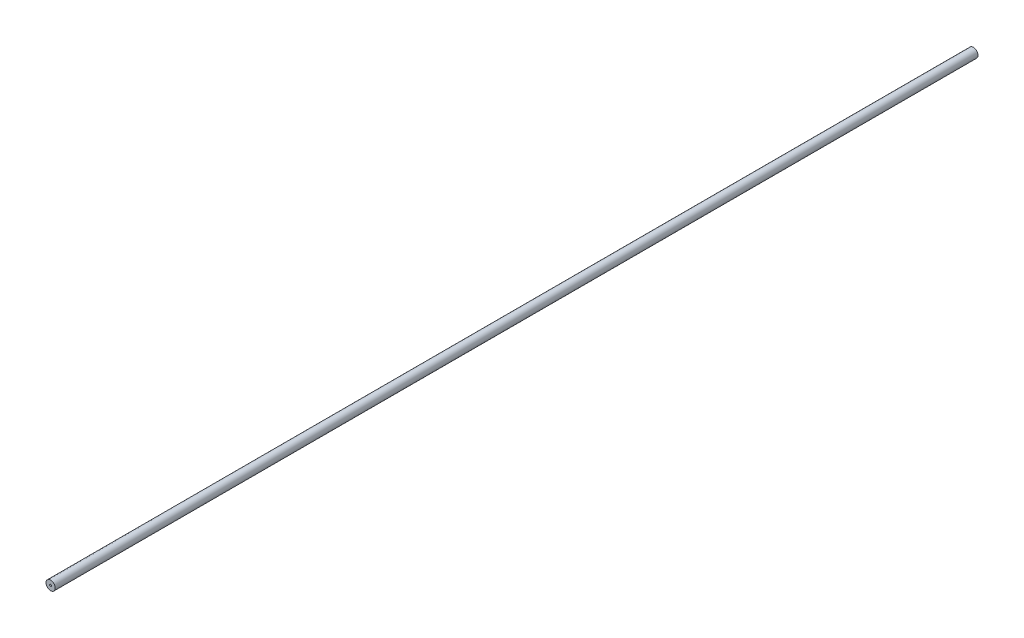
ISO-10303-21;
HEADER;
FILE_DESCRIPTION(('STEP AP214'),'2;1');
FILE_NAME('part.step','',(''),(''),'','','');
FILE_SCHEMA(('AUTOMOTIVE_DESIGN { 1 0 10303 214 1 1 1 1 }'));
ENDSEC;
DATA;
#1=APPLICATION_CONTEXT('core data for automotive mechanical design processes');
#2=APPLICATION_PROTOCOL_DEFINITION('international standard','automotive_design',2000,#1);
#3=PRODUCT_CONTEXT('',#1,'mechanical');
#4=PRODUCT('Part','Part','',(#3));
#5=PRODUCT_RELATED_PRODUCT_CATEGORY('part','',(#4));
#6=PRODUCT_DEFINITION_FORMATION('','',#4);
#7=PRODUCT_DEFINITION_CONTEXT('part definition',#1,'design');
#8=PRODUCT_DEFINITION('design','',#6,#7);
#9=PRODUCT_DEFINITION_SHAPE('','',#8);
#10=(LENGTH_UNIT() NAMED_UNIT(*) SI_UNIT(.MILLI.,.METRE.));
#11=(NAMED_UNIT(*) PLANE_ANGLE_UNIT() SI_UNIT($,.RADIAN.));
#12=(NAMED_UNIT(*) SI_UNIT($,.STERADIAN.) SOLID_ANGLE_UNIT());
#13=UNCERTAINTY_MEASURE_WITH_UNIT(LENGTH_MEASURE(1.E-05),#10,'distance_accuracy_value','');
#14=(GEOMETRIC_REPRESENTATION_CONTEXT(3) GLOBAL_UNCERTAINTY_ASSIGNED_CONTEXT((#13)) GLOBAL_UNIT_ASSIGNED_CONTEXT((#10,
#11,#12)) REPRESENTATION_CONTEXT('',''));
#15=CARTESIAN_POINT('',(0.,0.,0.));
#16=DIRECTION('',(0.,0.,1.));
#17=DIRECTION('',(1.,0.,0.));
#18=AXIS2_PLACEMENT_3D('',#15,#16,#17);
#19=CARTESIAN_POINT('',(0.,0.,500.));
#20=DIRECTION('',(0.,0.,1.));
#21=DIRECTION('',(1.,0.,0.));
#22=AXIS2_PLACEMENT_3D('',#19,#20,#21);
#23=PLANE('',#22);
#24=CARTESIAN_POINT('',(0.,0.,500.));
#25=DIRECTION('',(0.,0.,1.));
#26=DIRECTION('',(1.,0.,0.));
#27=AXIS2_PLACEMENT_3D('',#24,#25,#26);
#28=CIRCLE('',#27,2.5);
#29=CARTESIAN_POINT('',(2.5,0.,500.));
#30=VERTEX_POINT('',#29);
#31=EDGE_CURVE('E11',#30,#30,#28,.T.);
#32=ORIENTED_EDGE('',*,*,#31,.T.);
#33=EDGE_LOOP('',(#32));
#34=FACE_BOUND('',#33,.T.);
#35=CARTESIAN_POINT('',(0.,0.,500.));
#36=DIRECTION('',(0.,0.,1.));
#37=DIRECTION('',(1.,0.,0.));
#38=AXIS2_PLACEMENT_3D('',#35,#36,#37);
#39=CIRCLE('',#38,0.5);
#40=CARTESIAN_POINT('',(0.5,0.,500.));
#41=VERTEX_POINT('',#40);
#42=EDGE_CURVE('E60',#41,#41,#39,.T.);
#43=ORIENTED_EDGE('',*,*,#42,.F.);
#44=EDGE_LOOP('',(#43));
#45=FACE_BOUND('',#44,.T.);
#46=ADVANCED_FACE('F47',(#34,#45),#23,.T.);
#47=CARTESIAN_POINT('',(0.,0.,0.));
#48=DIRECTION('',(0.,0.,1.));
#49=DIRECTION('',(1.,0.,0.));
#50=AXIS2_PLACEMENT_3D('',#47,#48,#49);
#51=PLANE('',#50);
#52=CARTESIAN_POINT('',(0.,0.,0.));
#53=DIRECTION('',(0.,0.,1.));
#54=DIRECTION('',(1.,0.,0.));
#55=AXIS2_PLACEMENT_3D('',#52,#53,#54);
#56=CIRCLE('',#55,2.5);
#57=CARTESIAN_POINT('',(2.5,0.,0.));
#58=VERTEX_POINT('',#57);
#59=EDGE_CURVE('E51',#58,#58,#56,.T.);
#60=ORIENTED_EDGE('',*,*,#59,.F.);
#61=EDGE_LOOP('',(#60));
#62=FACE_BOUND('',#61,.T.);
#63=CARTESIAN_POINT('',(0.,0.,0.));
#64=DIRECTION('',(0.,0.,1.));
#65=DIRECTION('',(1.,0.,0.));
#66=AXIS2_PLACEMENT_3D('',#63,#64,#65);
#67=CIRCLE('',#66,0.5);
#68=CARTESIAN_POINT('',(0.5,0.,0.));
#69=VERTEX_POINT('',#68);
#70=EDGE_CURVE('E62',#69,#69,#67,.T.);
#71=ORIENTED_EDGE('',*,*,#70,.T.);
#72=EDGE_LOOP('',(#71));
#73=FACE_BOUND('',#72,.T.);
#74=ADVANCED_FACE('F74',(#62,#73),#51,.F.);
#75=CARTESIAN_POINT('',(0.,0.,500.));
#76=DIRECTION('',(0.,0.,-1.));
#77=DIRECTION('',(-1.,0.,0.));
#78=AXIS2_PLACEMENT_3D('',#75,#76,#77);
#79=CYLINDRICAL_SURFACE('',#78,2.5);
#80=ORIENTED_EDGE('',*,*,#31,.F.);
#81=EDGE_LOOP('',(#80));
#82=FACE_BOUND('',#81,.T.);
#83=ORIENTED_EDGE('',*,*,#59,.T.);
#84=EDGE_LOOP('',(#83));
#85=FACE_BOUND('',#84,.T.);
#86=ADVANCED_FACE('F49',(#82,#85),#79,.T.);
#87=CARTESIAN_POINT('',(0.,0.,500.));
#88=DIRECTION('',(0.,0.,-1.));
#89=DIRECTION('',(-1.,0.,0.));
#90=AXIS2_PLACEMENT_3D('',#87,#88,#89);
#91=CYLINDRICAL_SURFACE('',#90,0.5);
#92=ORIENTED_EDGE('',*,*,#42,.T.);
#93=EDGE_LOOP('',(#92));
#94=FACE_BOUND('',#93,.T.);
#95=ORIENTED_EDGE('',*,*,#70,.F.);
#96=EDGE_LOOP('',(#95));
#97=FACE_BOUND('',#96,.T.);
#98=ADVANCED_FACE('F70',(#94,#97),#91,.F.);
#99=CLOSED_SHELL('',(#46,#74,#86,#98));
#100=MANIFOLD_SOLID_BREP('B2',#99);
#101=ADVANCED_BREP_SHAPE_REPRESENTATION('',(#18,#100),#14);
#102=SHAPE_DEFINITION_REPRESENTATION(#9,#101);
ENDSEC;
END-ISO-10303-21;
